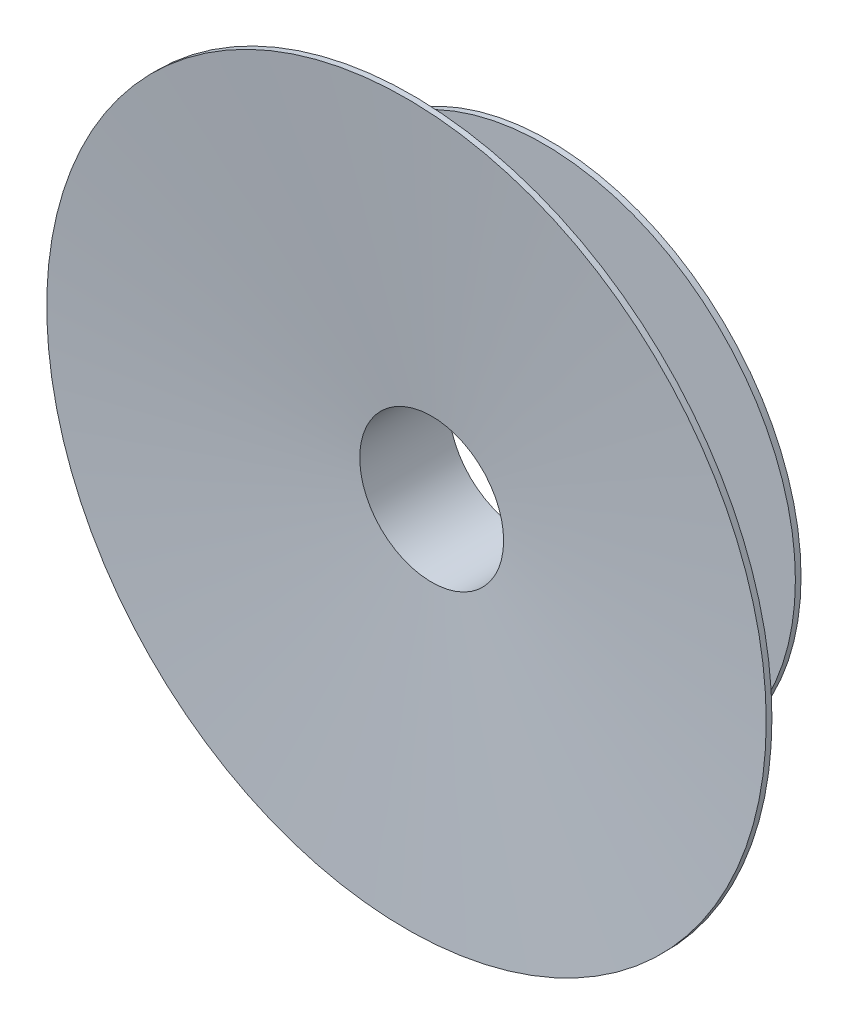
ISO-10303-21;
HEADER;
FILE_DESCRIPTION(('STEP AP214'),'2;1');
FILE_NAME('part.step','',(''),(''),'','','');
FILE_SCHEMA(('AUTOMOTIVE_DESIGN { 1 0 10303 214 1 1 1 1 }'));
ENDSEC;
DATA;
#1=APPLICATION_CONTEXT('core data for automotive mechanical design processes');
#2=APPLICATION_PROTOCOL_DEFINITION('international standard','automotive_design',2000,#1);
#3=PRODUCT_CONTEXT('',#1,'mechanical');
#4=PRODUCT('Part','Part','',(#3));
#5=PRODUCT_RELATED_PRODUCT_CATEGORY('part','',(#4));
#6=PRODUCT_DEFINITION_FORMATION('','',#4);
#7=PRODUCT_DEFINITION_CONTEXT('part definition',#1,'design');
#8=PRODUCT_DEFINITION('design','',#6,#7);
#9=PRODUCT_DEFINITION_SHAPE('','',#8);
#10=(LENGTH_UNIT() NAMED_UNIT(*) SI_UNIT(.MILLI.,.METRE.));
#11=(NAMED_UNIT(*) PLANE_ANGLE_UNIT() SI_UNIT($,.RADIAN.));
#12=(NAMED_UNIT(*) SI_UNIT($,.STERADIAN.) SOLID_ANGLE_UNIT());
#13=UNCERTAINTY_MEASURE_WITH_UNIT(LENGTH_MEASURE(1.E-05),#10,'distance_accuracy_value','');
#14=(GEOMETRIC_REPRESENTATION_CONTEXT(3) GLOBAL_UNCERTAINTY_ASSIGNED_CONTEXT((#13)) GLOBAL_UNIT_ASSIGNED_CONTEXT((#10,
#11,#12)) REPRESENTATION_CONTEXT('',''));
#15=CARTESIAN_POINT('',(0.,0.,0.));
#16=DIRECTION('',(0.,0.,1.));
#17=DIRECTION('',(1.,0.,0.));
#18=AXIS2_PLACEMENT_3D('',#15,#16,#17);
#19=CARTESIAN_POINT('',(0.,0.,-29.5));
#20=DIRECTION('',(0.,0.,1.));
#21=DIRECTION('',(1.,0.,0.));
#22=AXIS2_PLACEMENT_3D('',#19,#20,#21);
#23=PLANE('',#22);
#24=CARTESIAN_POINT('',(0.,0.,-29.5));
#25=DIRECTION('',(0.,0.,1.));
#26=DIRECTION('',(1.,0.,0.));
#27=AXIS2_PLACEMENT_3D('',#24,#25,#26);
#28=CIRCLE('',#27,31.1064223959627);
#29=CARTESIAN_POINT('',(31.1064223959627,0.,-29.5));
#30=VERTEX_POINT('',#29);
#31=EDGE_CURVE('E10',#30,#30,#28,.T.);
#32=ORIENTED_EDGE('',*,*,#31,.F.);
#33=EDGE_LOOP('',(#32));
#34=FACE_BOUND('',#33,.T.);
#35=CARTESIAN_POINT('',(0.,0.,-29.5));
#36=DIRECTION('',(0.,0.,1.));
#37=DIRECTION('',(1.,0.,0.));
#38=AXIS2_PLACEMENT_3D('',#35,#36,#37);
#39=CIRCLE('',#38,25.4);
#40=CARTESIAN_POINT('',(25.4,0.,-29.5));
#41=VERTEX_POINT('',#40);
#42=EDGE_CURVE('E50',#41,#41,#39,.T.);
#43=ORIENTED_EDGE('',*,*,#42,.T.);
#44=EDGE_LOOP('',(#43));
#45=FACE_BOUND('',#44,.T.);
#46=ADVANCED_FACE('F39',(#34,#45),#23,.F.);
#47=CARTESIAN_POINT('',(0.,0.,14.0519548949101));
#48=DIRECTION('',(0.,0.,1.));
#49=DIRECTION('',(1.,0.,0.));
#50=AXIS2_PLACEMENT_3D('',#47,#48,#49);
#51=CYLINDRICAL_SURFACE('',#50,25.4);
#52=ORIENTED_EDGE('',*,*,#42,.F.);
#53=EDGE_LOOP('',(#52));
#54=FACE_BOUND('',#53,.T.);
#55=CARTESIAN_POINT('',(0.,0.,2.));
#56=DIRECTION('',(0.,0.,1.));
#57=DIRECTION('',(1.,0.,0.));
#58=AXIS2_PLACEMENT_3D('',#55,#56,#57);
#59=CIRCLE('',#58,25.4);
#60=CARTESIAN_POINT('',(25.4,0.,2.));
#61=VERTEX_POINT('',#60);
#62=EDGE_CURVE('E43',#61,#61,#59,.T.);
#63=ORIENTED_EDGE('',*,*,#62,.T.);
#64=EDGE_LOOP('',(#63));
#65=FACE_BOUND('',#64,.T.);
#66=ADVANCED_FACE('F83',(#54,#65),#51,.F.);
#67=CARTESIAN_POINT('',(0.,0.,11.1013751101608));
#68=DIRECTION('',(0.,0.,1.));
#69=DIRECTION('',(1.,0.,0.));
#70=AXIS2_PLACEMENT_3D('',#67,#68,#69);
#71=TOROIDAL_SURFACE('',#70,61.6378543827531,48.8081396855008);
#72=CARTESIAN_POINT('',(0.,0.,-23.6837341583861));
#73=DIRECTION('',(0.,0.,1.));
#74=DIRECTION('',(1.,0.,0.));
#75=AXIS2_PLACEMENT_3D('',#72,#73,#74);
#76=CIRCLE('',#75,27.4);
#77=CARTESIAN_POINT('',(27.4,0.,-23.6837341583861));
#78=VERTEX_POINT('',#77);
#79=EDGE_CURVE('E66',#78,#78,#76,.T.);
#80=ORIENTED_EDGE('',*,*,#79,.F.);
#81=EDGE_LOOP('',(#80));
#82=FACE_BOUND('',#81,.T.);
#83=CARTESIAN_POINT('',(0.,0.,-37.5));
#84=DIRECTION('',(0.,0.,1.));
#85=DIRECTION('',(1.,0.,0.));
#86=AXIS2_PLACEMENT_3D('',#83,#84,#85);
#87=CIRCLE('',#86,57.15);
#88=CARTESIAN_POINT('',(57.15,0.,-37.5));
#89=VERTEX_POINT('',#88);
#90=EDGE_CURVE('E62',#89,#89,#87,.T.);
#91=ORIENTED_EDGE('',*,*,#90,.T.);
#92=EDGE_LOOP('',(#91));
#93=FACE_BOUND('',#92,.T.);
#94=ADVANCED_FACE('F105',(#82,#93),#71,.F.);
#95=CARTESIAN_POINT('',(0.,-57.15,-37.5));
#96=DIRECTION('',(0.,0.,1.));
#97=DIRECTION('',(1.,0.,0.));
#98=AXIS2_PLACEMENT_3D('',#95,#96,#97);
#99=PLANE('',#98);
#100=CARTESIAN_POINT('',(0.,0.,-37.5));
#101=DIRECTION('',(0.,0.,1.));
#102=DIRECTION('',(1.,0.,0.));
#103=AXIS2_PLACEMENT_3D('',#100,#101,#102);
#104=CIRCLE('',#103,88.9);
#105=CARTESIAN_POINT('',(88.9,0.,-37.5));
#106=VERTEX_POINT('',#105);
#107=EDGE_CURVE('E58',#106,#106,#104,.T.);
#108=ORIENTED_EDGE('',*,*,#107,.T.);
#109=EDGE_LOOP('',(#108));
#110=FACE_BOUND('',#109,.T.);
#111=ORIENTED_EDGE('',*,*,#90,.F.);
#112=EDGE_LOOP('',(#111));
#113=FACE_BOUND('',#112,.T.);
#114=ADVANCED_FACE('F113',(#110,#113),#99,.T.);
#115=CARTESIAN_POINT('',(0.,0.,14.0519548949101));
#116=DIRECTION('',(0.,0.,1.));
#117=DIRECTION('',(1.,0.,0.));
#118=AXIS2_PLACEMENT_3D('',#115,#116,#117);
#119=CYLINDRICAL_SURFACE('',#118,88.9);
#120=CARTESIAN_POINT('',(0.,0.,-39.5));
#121=DIRECTION('',(0.,0.,1.));
#122=DIRECTION('',(1.,0.,0.));
#123=AXIS2_PLACEMENT_3D('',#120,#121,#122);
#124=CIRCLE('',#123,88.9);
#125=CARTESIAN_POINT('',(88.9,0.,-39.5));
#126=VERTEX_POINT('',#125);
#127=EDGE_CURVE('E60',#126,#126,#124,.T.);
#128=ORIENTED_EDGE('',*,*,#127,.T.);
#129=EDGE_LOOP('',(#128));
#130=FACE_BOUND('',#129,.T.);
#131=ORIENTED_EDGE('',*,*,#107,.F.);
#132=EDGE_LOOP('',(#131));
#133=FACE_BOUND('',#132,.T.);
#134=ADVANCED_FACE('F107',(#130,#133),#119,.T.);
#135=CARTESIAN_POINT('',(0.,-88.9,-39.5));
#136=DIRECTION('',(0.,0.,-1.));
#137=DIRECTION('',(-1.,0.,0.));
#138=AXIS2_PLACEMENT_3D('',#135,#136,#137);
#139=PLANE('',#138);
#140=CARTESIAN_POINT('',(0.,0.,-39.5));
#141=DIRECTION('',(0.,0.,1.));
#142=DIRECTION('',(1.,0.,0.));
#143=AXIS2_PLACEMENT_3D('',#140,#141,#142);
#144=CIRCLE('',#143,57.15);
#145=CARTESIAN_POINT('',(57.15,0.,-39.5));
#146=VERTEX_POINT('',#145);
#147=EDGE_CURVE('E53',#146,#146,#144,.T.);
#148=ORIENTED_EDGE('',*,*,#147,.T.);
#149=EDGE_LOOP('',(#148));
#150=FACE_BOUND('',#149,.T.);
#151=ORIENTED_EDGE('',*,*,#127,.F.);
#152=EDGE_LOOP('',(#151));
#153=FACE_BOUND('',#152,.T.);
#154=ADVANCED_FACE('F94',(#150,#153),#139,.T.);
#155=CARTESIAN_POINT('',(0.,0.,11.1013751101608));
#156=DIRECTION('',(0.,0.,1.));
#157=DIRECTION('',(1.,0.,0.));
#158=AXIS2_PLACEMENT_3D('',#155,#156,#157);
#159=TOROIDAL_SURFACE('',#158,61.6378543827531,50.8);
#160=ORIENTED_EDGE('',*,*,#147,.F.);
#161=EDGE_LOOP('',(#160));
#162=FACE_BOUND('',#161,.T.);
#163=ORIENTED_EDGE('',*,*,#31,.T.);
#164=EDGE_LOOP('',(#163));
#165=FACE_BOUND('',#164,.T.);
#166=ADVANCED_FACE('F41',(#162,#165),#159,.T.);
#167=CARTESIAN_POINT('',(0.,0.,14.0519548949101));
#168=DIRECTION('',(0.,0.,1.));
#169=DIRECTION('',(1.,0.,0.));
#170=AXIS2_PLACEMENT_3D('',#167,#168,#169);
#171=CYLINDRICAL_SURFACE('',#170,27.4);
#172=ORIENTED_EDGE('',*,*,#79,.T.);
#173=EDGE_LOOP('',(#172));
#174=FACE_BOUND('',#173,.T.);
#175=CARTESIAN_POINT('',(0.,0.,0.167337651965156));
#176=DIRECTION('',(0.,0.,1.));
#177=DIRECTION('',(1.,0.,0.));
#178=AXIS2_PLACEMENT_3D('',#175,#176,#177);
#179=CIRCLE('',#178,27.4);
#180=CARTESIAN_POINT('',(27.3999999999999,0.,0.167337651965154));
#181=VERTEX_POINT('',#180);
#182=EDGE_CURVE('E68',#181,#181,#179,.T.);
#183=ORIENTED_EDGE('',*,*,#182,.F.);
#184=EDGE_LOOP('',(#183));
#185=FACE_BOUND('',#184,.T.);
#186=ADVANCED_FACE('F93',(#174,#185),#171,.T.);
#187=CARTESIAN_POINT('',(0.,0.,8.88120853914679));
#188=DIRECTION('',(0.,0.,1.));
#189=DIRECTION('',(1.,0.,0.));
#190=AXIS2_PLACEMENT_3D('',#187,#188,#189);
#191=CONICAL_SURFACE('',#190,127.,1.48352986419518);
#192=CARTESIAN_POINT('',(0.,0.,8.88120853914679));
#193=DIRECTION('',(0.,0.,1.));
#194=DIRECTION('',(1.,0.,0.));
#195=AXIS2_PLACEMENT_3D('',#192,#193,#194);
#196=CIRCLE('',#195,127.);
#197=CARTESIAN_POINT('',(127.,0.,8.88120853914679));
#198=VERTEX_POINT('',#197);
#199=EDGE_CURVE('E75',#198,#198,#196,.T.);
#200=CARTESIAN_POINT('',(27.3999999999999,0.,0.167337651965154));
#201=CARTESIAN_POINT('',(28.4374999999999,0.,0.258107140373295));
#202=CARTESIAN_POINT('',(29.4749999999999,0.,0.348876628781438));
#203=CARTESIAN_POINT('',(31.5499999999999,0.,0.530415605597722));
#204=CARTESIAN_POINT('',(32.5874999999999,0.,0.621185094005864));
#205=CARTESIAN_POINT('',(34.6624999999999,0.,0.802724070822148));
#206=CARTESIAN_POINT('',(35.6999999999999,0.,0.89349355923029));
#207=CARTESIAN_POINT('',(37.7749999999999,0.,1.07503253604657));
#208=CARTESIAN_POINT('',(38.8124999999999,0.,1.16580202445472));
#209=CARTESIAN_POINT('',(40.8874999999999,0.,1.347341001271));
#210=CARTESIAN_POINT('',(41.9249999999999,0.,1.43811048967914));
#211=CARTESIAN_POINT('',(43.9999999999999,0.,1.61964946649543));
#212=CARTESIAN_POINT('',(45.0374999999999,0.,1.71041895490357));
#213=CARTESIAN_POINT('',(47.1124999999999,0.,1.89195793171985));
#214=CARTESIAN_POINT('',(48.1499999999999,0.,1.98272742012799));
#215=CARTESIAN_POINT('',(50.2249999999999,0.,2.16426639694428));
#216=CARTESIAN_POINT('',(51.2624999999999,0.,2.25503588535242));
#217=CARTESIAN_POINT('',(53.3374999999999,0.,2.4365748621687));
#218=CARTESIAN_POINT('',(54.3749999999999,0.,2.52734435057685));
#219=CARTESIAN_POINT('',(56.4499999999999,0.,2.70888332739313));
#220=CARTESIAN_POINT('',(57.4874999999999,0.,2.79965281580127));
#221=CARTESIAN_POINT('',(59.5624999999999,0.,2.98119179261756));
#222=CARTESIAN_POINT('',(60.5999999999999,0.,3.0719612810257));
#223=CARTESIAN_POINT('',(62.6749999999999,0.,3.25350025784198));
#224=CARTESIAN_POINT('',(63.7124999999999,0.,3.34426974625013));
#225=CARTESIAN_POINT('',(65.7874999999999,0.,3.52580872306641));
#226=CARTESIAN_POINT('',(66.8249999999999,0.,3.61657821147455));
#227=CARTESIAN_POINT('',(68.8999999999999,0.,3.79811718829084));
#228=CARTESIAN_POINT('',(69.9374999999999,0.,3.88888667669898));
#229=CARTESIAN_POINT('',(72.0124999999999,0.,4.07042565351526));
#230=CARTESIAN_POINT('',(73.05,0.,4.1611951419234));
#231=CARTESIAN_POINT('',(75.1249999999999,0.,4.34273411873969));
#232=CARTESIAN_POINT('',(76.1625,0.,4.43350360714783));
#233=CARTESIAN_POINT('',(78.2374999999999,0.,4.61504258396411));
#234=CARTESIAN_POINT('',(79.275,0.,4.70581207237226));
#235=CARTESIAN_POINT('',(81.35,0.,4.88735104918854));
#236=CARTESIAN_POINT('',(82.3874999999999,0.,4.97812053759668));
#237=CARTESIAN_POINT('',(84.4624999999999,0.,5.15965951441297));
#238=CARTESIAN_POINT('',(85.5,0.,5.25042900282111));
#239=CARTESIAN_POINT('',(87.575,0.,5.43196797963739));
#240=CARTESIAN_POINT('',(88.6125,0.,5.52273746804553));
#241=CARTESIAN_POINT('',(90.6875,0.,5.70427644486182));
#242=CARTESIAN_POINT('',(91.725,0.,5.79504593326996));
#243=CARTESIAN_POINT('',(93.8,0.,5.97658491008624));
#244=CARTESIAN_POINT('',(94.8375,0.,6.06735439849439));
#245=CARTESIAN_POINT('',(96.9125,0.,6.24889337531067));
#246=CARTESIAN_POINT('',(97.95,0.,6.33966286371881));
#247=CARTESIAN_POINT('',(100.025,0.,6.5212018405351));
#248=CARTESIAN_POINT('',(101.0625,0.,6.61197132894324));
#249=CARTESIAN_POINT('',(103.1375,0.,6.79351030575952));
#250=CARTESIAN_POINT('',(104.175,0.,6.88427979416767));
#251=CARTESIAN_POINT('',(106.25,0.,7.06581877098395));
#252=CARTESIAN_POINT('',(107.2875,0.,7.15658825939209));
#253=CARTESIAN_POINT('',(109.3625,0.,7.33812723620837));
#254=CARTESIAN_POINT('',(110.4,0.,7.42889672461652));
#255=CARTESIAN_POINT('',(112.475,0.,7.6104357014328));
#256=CARTESIAN_POINT('',(113.5125,0.,7.70120518984094));
#257=CARTESIAN_POINT('',(115.5875,0.,7.88274416665723));
#258=CARTESIAN_POINT('',(116.625,0.,7.97351365506537));
#259=CARTESIAN_POINT('',(118.7,0.,8.15505263188165));
#260=CARTESIAN_POINT('',(119.7375,0.,8.24582212028979));
#261=CARTESIAN_POINT('',(121.8125,0.,8.42736109710608));
#262=CARTESIAN_POINT('',(122.85,0.,8.51813058551422));
#263=CARTESIAN_POINT('',(124.925,0.,8.69966956233051));
#264=CARTESIAN_POINT('',(125.9625,0.,8.79043905073865));
#265=CARTESIAN_POINT('',(127.,0.,8.88120853914679));
#266=B_SPLINE_CURVE_WITH_KNOTS('',3,(#200,#201,#202,#203,#204,#205,#206,#207,#208,#209,#210,
#211,#212,#213,#214,#215,#216,#217,#218,#219,#220,#221,#222,#223,#224,#225,#226,#227,#228,#229,
#230,#231,#232,#233,#234,#235,#236,#237,#238,#239,#240,#241,#242,#243,#244,#245,#246,#247,#248,
#249,#250,#251,#252,#253,#254,#255,#256,#257,#258,#259,#260,#261,#262,#263,#264,#265),
.UNSPECIFIED.,.F.,.F.,(4,2,2,2,2,2,2,2,2,2,2,2,2,2,2,2,2,2,2,2,2,2,2,2,2,2,2,2,2,2,2,2,4),(0.,
3.12438924435366,6.24877848870734,9.37316773306102,12.4975569774147,15.6219462217683,
18.746335466122,21.8707247104757,24.9951139548294,28.119503199183,31.2438924435367,
34.3682816878904,37.4926709322441,40.6170601765977,43.7414494209514,46.8658386653051,
49.9902279096587,53.1146171540124,56.2390063983661,59.3633956427198,62.4877848870734,
65.6121741314271,68.7365633757808,71.8609526201344,74.9853418644881,78.1097311088418,
81.2341203531954,84.3585095975491,87.4828988419028,90.6072880862564,93.7316773306101,
96.8560665749638,99.9804558193174),.UNSPECIFIED.);
#267=EDGE_CURVE('BSEAM88',#181,#198,#266,.T.);
#268=ORIENTED_EDGE('',*,*,#182,.T.);
#269=ORIENTED_EDGE('',*,*,#199,.F.);
#270=ORIENTED_EDGE('',*,*,#267,.T.);
#271=ORIENTED_EDGE('',*,*,#267,.F.);
#272=EDGE_LOOP('',(#268,#270,#269,#271));
#273=FACE_BOUND('',#272,.T.);
#274=ADVANCED_FACE('F88',(#273),#191,.T.);
#275=CARTESIAN_POINT('',(0.,0.,14.0519548949101));
#276=DIRECTION('',(0.,0.,1.));
#277=DIRECTION('',(1.,0.,0.));
#278=AXIS2_PLACEMENT_3D('',#275,#276,#277);
#279=CYLINDRICAL_SURFACE('',#278,127.);
#280=ORIENTED_EDGE('',*,*,#199,.T.);
#281=EDGE_LOOP('',(#280));
#282=FACE_BOUND('',#281,.T.);
#283=CARTESIAN_POINT('',(0.,0.,10.8888482142335));
#284=DIRECTION('',(0.,0.,1.));
#285=DIRECTION('',(1.,0.,0.));
#286=AXIS2_PLACEMENT_3D('',#283,#284,#285);
#287=CIRCLE('',#286,127.);
#288=CARTESIAN_POINT('',(127.,0.,10.8888482142335));
#289=VERTEX_POINT('',#288);
#290=EDGE_CURVE('E74',#289,#289,#287,.T.);
#291=ORIENTED_EDGE('',*,*,#290,.F.);
#292=EDGE_LOOP('',(#291));
#293=FACE_BOUND('',#292,.T.);
#294=ADVANCED_FACE('F81',(#282,#293),#279,.T.);
#295=CARTESIAN_POINT('',(0.,0.,2.));
#296=DIRECTION('',(0.,0.,1.));
#297=DIRECTION('',(1.,0.,0.));
#298=AXIS2_PLACEMENT_3D('',#295,#296,#297);
#299=CONICAL_SURFACE('',#298,25.4,1.48352986419518);
#300=CARTESIAN_POINT('',(127.,0.,10.8888482142335));
#301=CARTESIAN_POINT('',(125.941666666667,0.,10.7962560453352));
#302=CARTESIAN_POINT('',(124.883333333333,0.,10.703663876437));
#303=CARTESIAN_POINT('',(122.766666666667,0.,10.5184795386404));
#304=CARTESIAN_POINT('',(121.708333333333,0.,10.4258873697422));
#305=CARTESIAN_POINT('',(119.591666666667,0.,10.2407030319456));
#306=CARTESIAN_POINT('',(118.533333333333,0.,10.1481108630474));
#307=CARTESIAN_POINT('',(116.416666666667,0.,9.96292652525083));
#308=CARTESIAN_POINT('',(115.358333333333,0.,9.87033435635257));
#309=CARTESIAN_POINT('',(113.241666666667,0.,9.68515001855604));
#310=CARTESIAN_POINT('',(112.183333333333,0.,9.59255784965777));
#311=CARTESIAN_POINT('',(110.066666666667,0.,9.40737351186124));
#312=CARTESIAN_POINT('',(109.008333333333,0.,9.31478134296298));
#313=CARTESIAN_POINT('',(106.891666666667,0.,9.12959700516644));
#314=CARTESIAN_POINT('',(105.833333333333,0.,9.03700483626818));
#315=CARTESIAN_POINT('',(103.716666666667,0.,8.85182049847165));
#316=CARTESIAN_POINT('',(102.658333333333,0.,8.75922832957338));
#317=CARTESIAN_POINT('',(100.541666666667,0.,8.57404399177685));
#318=CARTESIAN_POINT('',(99.4833333333333,0.,8.48145182287859));
#319=CARTESIAN_POINT('',(97.3666666666667,0.,8.29626748508205));
#320=CARTESIAN_POINT('',(96.3083333333333,0.,8.20367531618379));
#321=CARTESIAN_POINT('',(94.1916666666667,0.,8.01849097838726));
#322=CARTESIAN_POINT('',(93.1333333333333,0.,7.92589880948899));
#323=CARTESIAN_POINT('',(91.0166666666667,0.,7.74071447169246));
#324=CARTESIAN_POINT('',(89.9583333333333,0.,7.64812230279419));
#325=CARTESIAN_POINT('',(87.8416666666667,0.,7.46293796499766));
#326=CARTESIAN_POINT('',(86.7833333333333,0.,7.3703457960994));
#327=CARTESIAN_POINT('',(84.6666666666667,0.,7.18516145830287));
#328=CARTESIAN_POINT('',(83.6083333333333,0.,7.0925692894046));
#329=CARTESIAN_POINT('',(81.4916666666667,0.,6.90738495160807));
#330=CARTESIAN_POINT('',(80.4333333333333,0.,6.81479278270981));
#331=CARTESIAN_POINT('',(78.3166666666667,0.,6.62960844491327));
#332=CARTESIAN_POINT('',(77.2583333333333,0.,6.53701627601501));
#333=CARTESIAN_POINT('',(75.1416666666667,0.,6.35183193821848));
#334=CARTESIAN_POINT('',(74.0833333333333,0.,6.25923976932021));
#335=CARTESIAN_POINT('',(71.9666666666667,0.,6.07405543152368));
#336=CARTESIAN_POINT('',(70.9083333333333,0.,5.98146326262542));
#337=CARTESIAN_POINT('',(68.7916666666667,0.,5.79627892482888));
#338=CARTESIAN_POINT('',(67.7333333333333,0.,5.70368675593062));
#339=CARTESIAN_POINT('',(65.6166666666667,0.,5.51850241813409));
#340=CARTESIAN_POINT('',(64.5583333333333,0.,5.42591024923582));
#341=CARTESIAN_POINT('',(62.4416666666667,0.,5.24072591143929));
#342=CARTESIAN_POINT('',(61.3833333333333,0.,5.14813374254103));
#343=CARTESIAN_POINT('',(59.2666666666667,0.,4.96294940474449));
#344=CARTESIAN_POINT('',(58.2083333333333,0.,4.87035723584623));
#345=CARTESIAN_POINT('',(56.0916666666667,0.,4.6851728980497));
#346=CARTESIAN_POINT('',(55.0333333333333,0.,4.59258072915143));
#347=CARTESIAN_POINT('',(52.9166666666667,0.,4.4073963913549));
#348=CARTESIAN_POINT('',(51.8583333333333,0.,4.31480422245664));
#349=CARTESIAN_POINT('',(49.7416666666667,0.,4.12961988466011));
#350=CARTESIAN_POINT('',(48.6833333333333,0.,4.03702771576184));
#351=CARTESIAN_POINT('',(46.5666666666667,0.,3.85184337796531));
#352=CARTESIAN_POINT('',(45.5083333333333,0.,3.75925120906704));
#353=CARTESIAN_POINT('',(43.3916666666667,0.,3.57406687127051));
#354=CARTESIAN_POINT('',(42.3333333333333,0.,3.48147470237225));
#355=CARTESIAN_POINT('',(40.2166666666667,0.,3.29629036457572));
#356=CARTESIAN_POINT('',(39.1583333333333,0.,3.20369819567745));
#357=CARTESIAN_POINT('',(37.0416666666667,0.,3.01851385788092));
#358=CARTESIAN_POINT('',(35.9833333333333,0.,2.92592168898265));
#359=CARTESIAN_POINT('',(33.8666666666667,0.,2.74073735118612));
#360=CARTESIAN_POINT('',(32.8083333333333,0.,2.64814518228786));
#361=CARTESIAN_POINT('',(30.6916666666667,0.,2.46296084449133));
#362=CARTESIAN_POINT('',(29.6333333333333,0.,2.37036867559306));
#363=CARTESIAN_POINT('',(27.5166666666667,0.,2.18518433779653));
#364=CARTESIAN_POINT('',(26.4583333333333,0.,2.09259216889826));
#365=CARTESIAN_POINT('',(25.4,0.,2.));
#366=B_SPLINE_CURVE_WITH_KNOTS('',3,(#300,#301,#302,#303,#304,#305,#306,#307,#308,#309,#310,
#311,#312,#313,#314,#315,#316,#317,#318,#319,#320,#321,#322,#323,#324,#325,#326,#327,#328,#329,
#330,#331,#332,#333,#334,#335,#336,#337,#338,#339,#340,#341,#342,#343,#344,#345,#346,#347,#348,
#349,#350,#351,#352,#353,#354,#355,#356,#357,#358,#359,#360,#361,#362,#363,#364,#365),
.UNSPECIFIED.,.F.,.F.,(4,2,2,2,2,2,2,2,2,2,2,2,2,2,2,2,2,2,2,2,2,2,2,2,2,2,2,2,2,2,2,2,4),(0.,
3.18712798420014,6.37425596840028,9.5613839526004,12.7485119368005,15.9356399210007,
19.1227679052008,22.3098958894009,25.497023873601,28.6841518578012,31.8712798420013,
35.0584078262014,38.2455358104015,41.4326637946017,44.6197917788018,47.8069197630019,
50.9940477472021,54.1811757314022,57.3683037156023,60.5554316998024,63.7425596840026,
66.9296876682027,70.1168156524028,73.3039436366029,76.4910716208031,79.6781996050032,
82.8653275892033,86.0524555734034,89.2395835576036,92.4267115418037,95.6138395260038,
98.8009675102039,101.988095494404),.UNSPECIFIED.);
#367=EDGE_CURVE('BSEAM82',#289,#61,#366,.T.);
#368=ORIENTED_EDGE('',*,*,#290,.T.);
#369=ORIENTED_EDGE('',*,*,#62,.F.);
#370=ORIENTED_EDGE('',*,*,#367,.T.);
#371=ORIENTED_EDGE('',*,*,#367,.F.);
#372=EDGE_LOOP('',(#368,#370,#369,#371));
#373=FACE_BOUND('',#372,.T.);
#374=ADVANCED_FACE('F82',(#373),#299,.F.);
#375=CLOSED_SHELL('',(#46,#66,#94,#114,#134,#154,#166,#186,#274,#294,#374));
#376=MANIFOLD_SOLID_BREP('B2',#375);
#377=ADVANCED_BREP_SHAPE_REPRESENTATION('',(#18,#376),#14);
#378=SHAPE_DEFINITION_REPRESENTATION(#9,#377);
ENDSEC;
END-ISO-10303-21;
